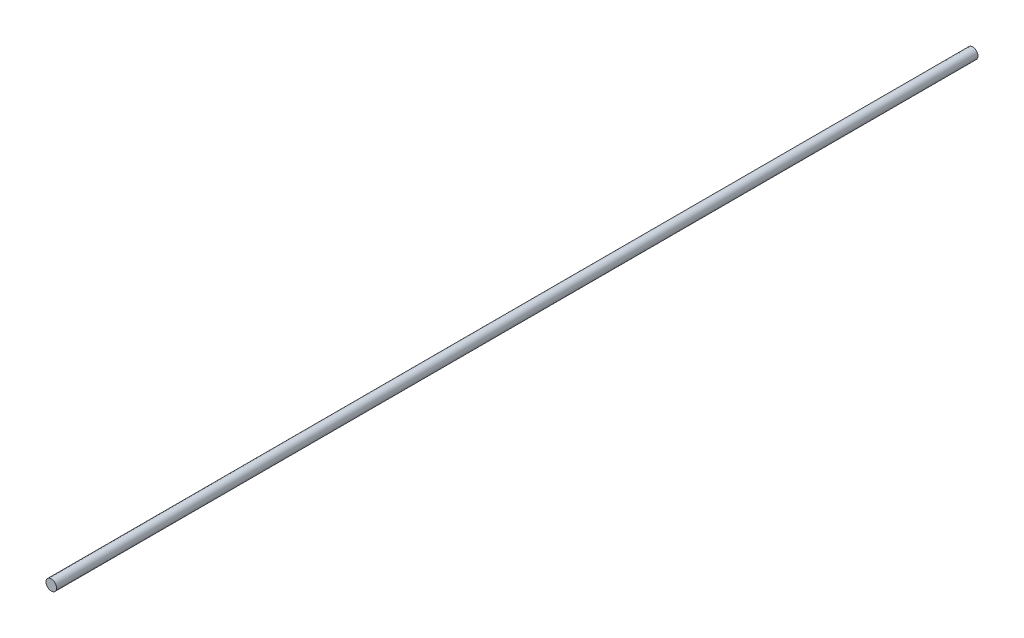
ISO-10303-21;
HEADER;
FILE_DESCRIPTION(('STEP AP214'),'2;1');
FILE_NAME('part.step','',(''),(''),'','','');
FILE_SCHEMA(('AUTOMOTIVE_DESIGN { 1 0 10303 214 1 1 1 1 }'));
ENDSEC;
DATA;
#1=APPLICATION_CONTEXT('core data for automotive mechanical design processes');
#2=APPLICATION_PROTOCOL_DEFINITION('international standard','automotive_design',2000,#1);
#3=PRODUCT_CONTEXT('',#1,'mechanical');
#4=PRODUCT('Part','Part','',(#3));
#5=PRODUCT_RELATED_PRODUCT_CATEGORY('part','',(#4));
#6=PRODUCT_DEFINITION_FORMATION('','',#4);
#7=PRODUCT_DEFINITION_CONTEXT('part definition',#1,'design');
#8=PRODUCT_DEFINITION('design','',#6,#7);
#9=PRODUCT_DEFINITION_SHAPE('','',#8);
#10=(LENGTH_UNIT() NAMED_UNIT(*) SI_UNIT(.MILLI.,.METRE.));
#11=(NAMED_UNIT(*) PLANE_ANGLE_UNIT() SI_UNIT($,.RADIAN.));
#12=(NAMED_UNIT(*) SI_UNIT($,.STERADIAN.) SOLID_ANGLE_UNIT());
#13=UNCERTAINTY_MEASURE_WITH_UNIT(LENGTH_MEASURE(1.E-05),#10,'distance_accuracy_value','');
#14=(GEOMETRIC_REPRESENTATION_CONTEXT(3) GLOBAL_UNCERTAINTY_ASSIGNED_CONTEXT((#13)) GLOBAL_UNIT_ASSIGNED_CONTEXT((#10,
#11,#12)) REPRESENTATION_CONTEXT('',''));
#15=CARTESIAN_POINT('',(0.,0.,0.));
#16=DIRECTION('',(0.,0.,1.));
#17=DIRECTION('',(1.,0.,0.));
#18=AXIS2_PLACEMENT_3D('',#15,#16,#17);
#19=CARTESIAN_POINT('',(0.,0.,1106.42769919075));
#20=DIRECTION('',(0.,0.,-1.));
#21=DIRECTION('',(-1.,0.,0.));
#22=AXIS2_PLACEMENT_3D('',#19,#20,#21);
#23=CYLINDRICAL_SURFACE('',#22,6.35);
#24=CARTESIAN_POINT('',(0.,0.,1106.42769919075));
#25=DIRECTION('',(0.,0.,1.));
#26=DIRECTION('',(1.,0.,0.));
#27=AXIS2_PLACEMENT_3D('',#24,#25,#26);
#28=CIRCLE('',#27,6.35);
#29=CARTESIAN_POINT('',(6.35,0.,1106.42769919075));
#30=VERTEX_POINT('',#29);
#31=EDGE_CURVE('E10',#30,#30,#28,.T.);
#32=ORIENTED_EDGE('',*,*,#31,.F.);
#33=EDGE_LOOP('',(#32));
#34=FACE_BOUND('',#33,.T.);
#35=CARTESIAN_POINT('',(0.,0.,0.));
#36=DIRECTION('',(0.,0.,1.));
#37=DIRECTION('',(1.,0.,0.));
#38=AXIS2_PLACEMENT_3D('',#35,#36,#37);
#39=CIRCLE('',#38,6.35);
#40=CARTESIAN_POINT('',(6.35,0.,0.));
#41=VERTEX_POINT('',#40);
#42=EDGE_CURVE('E42',#41,#41,#39,.T.);
#43=ORIENTED_EDGE('',*,*,#42,.T.);
#44=EDGE_LOOP('',(#43));
#45=FACE_BOUND('',#44,.T.);
#46=ADVANCED_FACE('F41',(#34,#45),#23,.T.);
#47=CARTESIAN_POINT('',(0.,0.,1106.42769919075));
#48=DIRECTION('',(0.,0.,1.));
#49=DIRECTION('',(1.,0.,0.));
#50=AXIS2_PLACEMENT_3D('',#47,#48,#49);
#51=PLANE('',#50);
#52=ORIENTED_EDGE('',*,*,#31,.T.);
#53=EDGE_LOOP('',(#52));
#54=FACE_BOUND('',#53,.T.);
#55=ADVANCED_FACE('F57',(#54),#51,.T.);
#56=CARTESIAN_POINT('',(0.,0.,0.));
#57=DIRECTION('',(0.,0.,1.));
#58=DIRECTION('',(1.,0.,0.));
#59=AXIS2_PLACEMENT_3D('',#56,#57,#58);
#60=PLANE('',#59);
#61=ORIENTED_EDGE('',*,*,#42,.F.);
#62=EDGE_LOOP('',(#61));
#63=FACE_BOUND('',#62,.T.);
#64=ADVANCED_FACE('F53',(#63),#60,.F.);
#65=CLOSED_SHELL('',(#46,#55,#64));
#66=MANIFOLD_SOLID_BREP('B2',#65);
#67=ADVANCED_BREP_SHAPE_REPRESENTATION('',(#18,#66),#14);
#68=SHAPE_DEFINITION_REPRESENTATION(#9,#67);
ENDSEC;
END-ISO-10303-21;
